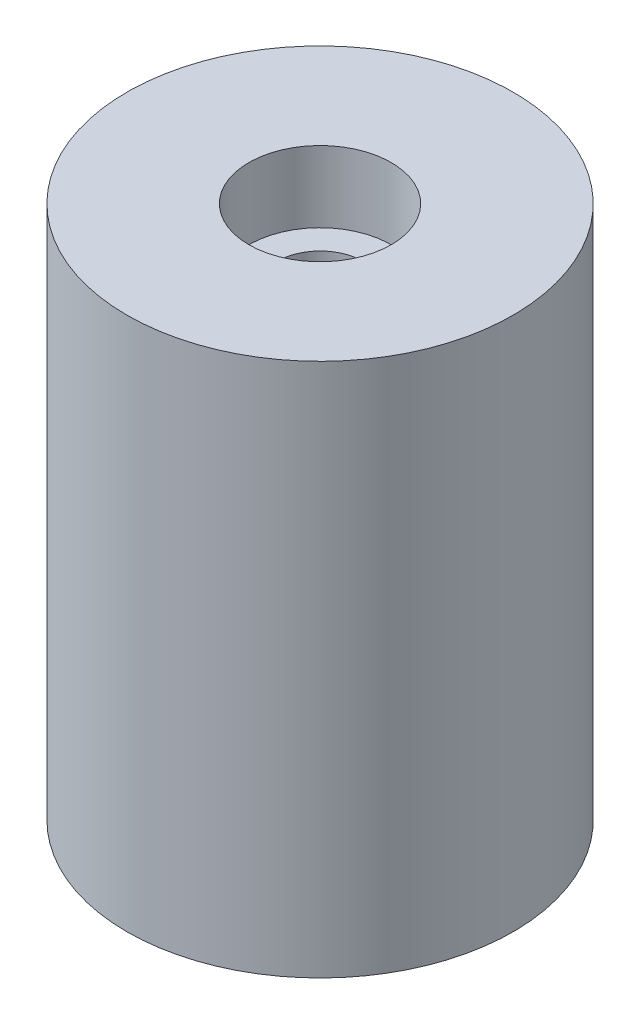
ISO-10303-21;
HEADER;
FILE_DESCRIPTION(('STEP AP214'),'2;1');
FILE_NAME('part.step','',(''),(''),'','','');
FILE_SCHEMA(('AUTOMOTIVE_DESIGN { 1 0 10303 214 1 1 1 1 }'));
ENDSEC;
DATA;
#1=APPLICATION_CONTEXT('core data for automotive mechanical design processes');
#2=APPLICATION_PROTOCOL_DEFINITION('international standard','automotive_design',2000,#1);
#3=PRODUCT_CONTEXT('',#1,'mechanical');
#4=PRODUCT('Part','Part','',(#3));
#5=PRODUCT_RELATED_PRODUCT_CATEGORY('part','',(#4));
#6=PRODUCT_DEFINITION_FORMATION('','',#4);
#7=PRODUCT_DEFINITION_CONTEXT('part definition',#1,'design');
#8=PRODUCT_DEFINITION('design','',#6,#7);
#9=PRODUCT_DEFINITION_SHAPE('','',#8);
#10=(LENGTH_UNIT() NAMED_UNIT(*) SI_UNIT(.MILLI.,.METRE.));
#11=(NAMED_UNIT(*) PLANE_ANGLE_UNIT() SI_UNIT($,.RADIAN.));
#12=(NAMED_UNIT(*) SI_UNIT($,.STERADIAN.) SOLID_ANGLE_UNIT());
#13=UNCERTAINTY_MEASURE_WITH_UNIT(LENGTH_MEASURE(1.E-05),#10,'distance_accuracy_value','');
#14=(GEOMETRIC_REPRESENTATION_CONTEXT(3) GLOBAL_UNCERTAINTY_ASSIGNED_CONTEXT((#13)) GLOBAL_UNIT_ASSIGNED_CONTEXT((#10,
#11,#12)) REPRESENTATION_CONTEXT('',''));
#15=CARTESIAN_POINT('',(0.,0.,0.));
#16=DIRECTION('',(0.,0.,1.));
#17=DIRECTION('',(1.,0.,0.));
#18=AXIS2_PLACEMENT_3D('',#15,#16,#17);
#19=CARTESIAN_POINT('',(0.,30.,0.));
#20=DIRECTION('',(0.,-1.,0.));
#21=DIRECTION('',(0.,0.,-1.));
#22=AXIS2_PLACEMENT_3D('',#19,#20,#21);
#23=CYLINDRICAL_SURFACE('',#22,10.85);
#24=CARTESIAN_POINT('',(0.,30.,0.));
#25=DIRECTION('',(0.,1.,0.));
#26=DIRECTION('',(0.,0.,1.));
#27=AXIS2_PLACEMENT_3D('',#24,#25,#26);
#28=CIRCLE('',#27,10.85);
#29=CARTESIAN_POINT('',(0.,30.,10.85));
#30=VERTEX_POINT('',#29);
#31=EDGE_CURVE('E10',#30,#30,#28,.T.);
#32=ORIENTED_EDGE('',*,*,#31,.F.);
#33=EDGE_LOOP('',(#32));
#34=FACE_BOUND('',#33,.T.);
#35=CARTESIAN_POINT('',(0.,0.,0.));
#36=DIRECTION('',(0.,1.,0.));
#37=DIRECTION('',(0.,0.,1.));
#38=AXIS2_PLACEMENT_3D('',#35,#36,#37);
#39=CIRCLE('',#38,10.85);
#40=CARTESIAN_POINT('',(0.,0.,10.85));
#41=VERTEX_POINT('',#40);
#42=EDGE_CURVE('E40',#41,#41,#39,.T.);
#43=ORIENTED_EDGE('',*,*,#42,.T.);
#44=EDGE_LOOP('',(#43));
#45=FACE_BOUND('',#44,.T.);
#46=ADVANCED_FACE('F37',(#34,#45),#23,.T.);
#47=CARTESIAN_POINT('',(0.,30.,0.));
#48=DIRECTION('',(0.,1.,0.));
#49=DIRECTION('',(0.,0.,1.));
#50=AXIS2_PLACEMENT_3D('',#47,#48,#49);
#51=PLANE('',#50);
#52=CARTESIAN_POINT('',(0.,30.,0.));
#53=DIRECTION('',(0.,1.,0.));
#54=DIRECTION('',(0.,0.,1.));
#55=AXIS2_PLACEMENT_3D('',#52,#53,#54);
#56=CIRCLE('',#55,4.);
#57=CARTESIAN_POINT('',(0.,30.,4.));
#58=VERTEX_POINT('',#57);
#59=EDGE_CURVE('E57',#58,#58,#56,.T.);
#60=ORIENTED_EDGE('',*,*,#59,.F.);
#61=EDGE_LOOP('',(#60));
#62=FACE_BOUND('',#61,.T.);
#63=ORIENTED_EDGE('',*,*,#31,.T.);
#64=EDGE_LOOP('',(#63));
#65=FACE_BOUND('',#64,.T.);
#66=ADVANCED_FACE('F63',(#62,#65),#51,.T.);
#67=CARTESIAN_POINT('',(0.,0.,0.));
#68=DIRECTION('',(0.,1.,0.));
#69=DIRECTION('',(0.,0.,1.));
#70=AXIS2_PLACEMENT_3D('',#67,#68,#69);
#71=PLANE('',#70);
#72=CARTESIAN_POINT('',(0.,0.,0.));
#73=DIRECTION('',(0.,1.,0.));
#74=DIRECTION('',(0.,0.,1.));
#75=AXIS2_PLACEMENT_3D('',#72,#73,#74);
#76=CIRCLE('',#75,2.39999999999999);
#77=CARTESIAN_POINT('',(0.,0.,2.39999999999999));
#78=VERTEX_POINT('',#77);
#79=EDGE_CURVE('E47',#78,#78,#76,.T.);
#80=ORIENTED_EDGE('',*,*,#79,.T.);
#81=EDGE_LOOP('',(#80));
#82=FACE_BOUND('',#81,.T.);
#83=ORIENTED_EDGE('',*,*,#42,.F.);
#84=EDGE_LOOP('',(#83));
#85=FACE_BOUND('',#84,.T.);
#86=ADVANCED_FACE('F65',(#82,#85),#71,.F.);
#87=CARTESIAN_POINT('',(0.,30.,0.));
#88=DIRECTION('',(0.,1.,0.));
#89=DIRECTION('',(0.,0.,1.));
#90=AXIS2_PLACEMENT_3D('',#87,#88,#89);
#91=CYLINDRICAL_SURFACE('',#90,2.4);
#92=ORIENTED_EDGE('',*,*,#79,.F.);
#93=EDGE_LOOP('',(#92));
#94=FACE_BOUND('',#93,.T.);
#95=CARTESIAN_POINT('',(0.,26.,0.));
#96=DIRECTION('',(0.,1.,0.));
#97=DIRECTION('',(0.,0.,1.));
#98=AXIS2_PLACEMENT_3D('',#95,#96,#97);
#99=CIRCLE('',#98,2.4);
#100=CARTESIAN_POINT('',(0.,26.,2.4));
#101=VERTEX_POINT('',#100);
#102=EDGE_CURVE('E51',#101,#101,#99,.T.);
#103=ORIENTED_EDGE('',*,*,#102,.T.);
#104=EDGE_LOOP('',(#103));
#105=FACE_BOUND('',#104,.T.);
#106=ADVANCED_FACE('F71',(#94,#105),#91,.F.);
#107=CARTESIAN_POINT('',(2.4,26.,0.));
#108=DIRECTION('',(0.,-1.,0.));
#109=DIRECTION('',(0.,0.,-1.));
#110=AXIS2_PLACEMENT_3D('',#107,#108,#109);
#111=PLANE('',#110);
#112=ORIENTED_EDGE('',*,*,#102,.F.);
#113=EDGE_LOOP('',(#112));
#114=FACE_BOUND('',#113,.T.);
#115=CARTESIAN_POINT('',(0.,26.,0.));
#116=DIRECTION('',(0.,1.,0.));
#117=DIRECTION('',(0.,0.,1.));
#118=AXIS2_PLACEMENT_3D('',#115,#116,#117);
#119=CIRCLE('',#118,4.);
#120=CARTESIAN_POINT('',(0.,26.,4.));
#121=VERTEX_POINT('',#120);
#122=EDGE_CURVE('E54',#121,#121,#119,.T.);
#123=ORIENTED_EDGE('',*,*,#122,.T.);
#124=EDGE_LOOP('',(#123));
#125=FACE_BOUND('',#124,.T.);
#126=ADVANCED_FACE('F77',(#114,#125),#111,.F.);
#127=CARTESIAN_POINT('',(0.,30.,0.));
#128=DIRECTION('',(0.,1.,0.));
#129=DIRECTION('',(0.,0.,1.));
#130=AXIS2_PLACEMENT_3D('',#127,#128,#129);
#131=CYLINDRICAL_SURFACE('',#130,4.);
#132=ORIENTED_EDGE('',*,*,#122,.F.);
#133=EDGE_LOOP('',(#132));
#134=FACE_BOUND('',#133,.T.);
#135=ORIENTED_EDGE('',*,*,#59,.T.);
#136=EDGE_LOOP('',(#135));
#137=FACE_BOUND('',#136,.T.);
#138=ADVANCED_FACE('F61',(#134,#137),#131,.F.);
#139=CLOSED_SHELL('',(#46,#66,#86,#106,#126,#138));
#140=MANIFOLD_SOLID_BREP('B2',#139);
#141=ADVANCED_BREP_SHAPE_REPRESENTATION('',(#18,#140),#14);
#142=SHAPE_DEFINITION_REPRESENTATION(#9,#141);
ENDSEC;
END-ISO-10303-21;
